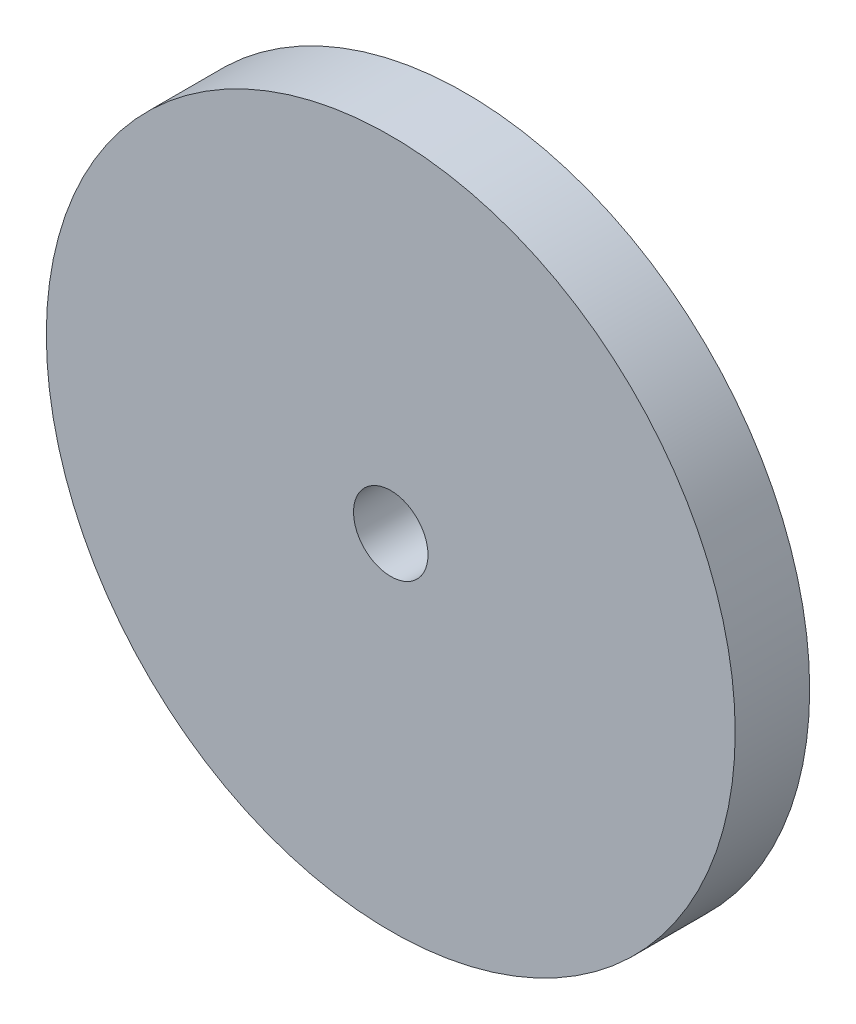
ISO-10303-21;
HEADER;
FILE_DESCRIPTION(('STEP AP214'),'2;1');
FILE_NAME('part.step','',(''),(''),'','','');
FILE_SCHEMA(('AUTOMOTIVE_DESIGN { 1 0 10303 214 1 1 1 1 }'));
ENDSEC;
DATA;
#1=APPLICATION_CONTEXT('core data for automotive mechanical design processes');
#2=APPLICATION_PROTOCOL_DEFINITION('international standard','automotive_design',2000,#1);
#3=PRODUCT_CONTEXT('',#1,'mechanical');
#4=PRODUCT('Part','Part','',(#3));
#5=PRODUCT_RELATED_PRODUCT_CATEGORY('part','',(#4));
#6=PRODUCT_DEFINITION_FORMATION('','',#4);
#7=PRODUCT_DEFINITION_CONTEXT('part definition',#1,'design');
#8=PRODUCT_DEFINITION('design','',#6,#7);
#9=PRODUCT_DEFINITION_SHAPE('','',#8);
#10=(LENGTH_UNIT() NAMED_UNIT(*) SI_UNIT(.MILLI.,.METRE.));
#11=(NAMED_UNIT(*) PLANE_ANGLE_UNIT() SI_UNIT($,.RADIAN.));
#12=(NAMED_UNIT(*) SI_UNIT($,.STERADIAN.) SOLID_ANGLE_UNIT());
#13=UNCERTAINTY_MEASURE_WITH_UNIT(LENGTH_MEASURE(1.E-05),#10,'distance_accuracy_value','');
#14=(GEOMETRIC_REPRESENTATION_CONTEXT(3) GLOBAL_UNCERTAINTY_ASSIGNED_CONTEXT((#13)) GLOBAL_UNIT_ASSIGNED_CONTEXT((#10,
#11,#12)) REPRESENTATION_CONTEXT('',''));
#15=CARTESIAN_POINT('',(0.,0.,0.));
#16=DIRECTION('',(0.,0.,1.));
#17=DIRECTION('',(1.,0.,0.));
#18=AXIS2_PLACEMENT_3D('',#15,#16,#17);
#19=CARTESIAN_POINT('',(0.,0.,4.));
#20=DIRECTION('',(0.,0.,1.));
#21=DIRECTION('',(1.,0.,0.));
#22=AXIS2_PLACEMENT_3D('',#19,#20,#21);
#23=PLANE('',#22);
#24=CARTESIAN_POINT('',(0.,0.,4.));
#25=DIRECTION('',(0.,0.,1.));
#26=DIRECTION('',(1.,0.,0.));
#27=AXIS2_PLACEMENT_3D('',#24,#25,#26);
#28=CIRCLE('',#27,18.5);
#29=CARTESIAN_POINT('',(18.5,0.,4.));
#30=VERTEX_POINT('',#29);
#31=EDGE_CURVE('E10',#30,#30,#28,.T.);
#32=ORIENTED_EDGE('',*,*,#31,.T.);
#33=EDGE_LOOP('',(#32));
#34=FACE_BOUND('',#33,.T.);
#35=CARTESIAN_POINT('',(0.,0.,4.));
#36=DIRECTION('',(0.,0.,1.));
#37=DIRECTION('',(1.,0.,0.));
#38=AXIS2_PLACEMENT_3D('',#35,#36,#37);
#39=CIRCLE('',#38,2.);
#40=CARTESIAN_POINT('',(2.,0.,4.));
#41=VERTEX_POINT('',#40);
#42=EDGE_CURVE('E56',#41,#41,#39,.T.);
#43=ORIENTED_EDGE('',*,*,#42,.F.);
#44=EDGE_LOOP('',(#43));
#45=FACE_BOUND('',#44,.T.);
#46=ADVANCED_FACE('F43',(#34,#45),#23,.T.);
#47=CARTESIAN_POINT('',(0.,0.,0.));
#48=DIRECTION('',(0.,0.,1.));
#49=DIRECTION('',(1.,0.,0.));
#50=AXIS2_PLACEMENT_3D('',#47,#48,#49);
#51=PLANE('',#50);
#52=CARTESIAN_POINT('',(0.,0.,0.));
#53=DIRECTION('',(0.,0.,1.));
#54=DIRECTION('',(1.,0.,0.));
#55=AXIS2_PLACEMENT_3D('',#52,#53,#54);
#56=CIRCLE('',#55,18.5);
#57=CARTESIAN_POINT('',(18.5,0.,0.));
#58=VERTEX_POINT('',#57);
#59=EDGE_CURVE('E47',#58,#58,#56,.T.);
#60=ORIENTED_EDGE('',*,*,#59,.F.);
#61=EDGE_LOOP('',(#60));
#62=FACE_BOUND('',#61,.T.);
#63=CARTESIAN_POINT('',(0.,0.,0.));
#64=DIRECTION('',(0.,0.,1.));
#65=DIRECTION('',(1.,0.,0.));
#66=AXIS2_PLACEMENT_3D('',#63,#64,#65);
#67=CIRCLE('',#66,2.);
#68=CARTESIAN_POINT('',(2.,0.,0.));
#69=VERTEX_POINT('',#68);
#70=EDGE_CURVE('E58',#69,#69,#67,.T.);
#71=ORIENTED_EDGE('',*,*,#70,.T.);
#72=EDGE_LOOP('',(#71));
#73=FACE_BOUND('',#72,.T.);
#74=ADVANCED_FACE('F70',(#62,#73),#51,.F.);
#75=CARTESIAN_POINT('',(0.,0.,4.));
#76=DIRECTION('',(0.,0.,-1.));
#77=DIRECTION('',(-1.,0.,0.));
#78=AXIS2_PLACEMENT_3D('',#75,#76,#77);
#79=CYLINDRICAL_SURFACE('',#78,18.5);
#80=ORIENTED_EDGE('',*,*,#31,.F.);
#81=EDGE_LOOP('',(#80));
#82=FACE_BOUND('',#81,.T.);
#83=ORIENTED_EDGE('',*,*,#59,.T.);
#84=EDGE_LOOP('',(#83));
#85=FACE_BOUND('',#84,.T.);
#86=ADVANCED_FACE('F45',(#82,#85),#79,.T.);
#87=CARTESIAN_POINT('',(0.,0.,4.));
#88=DIRECTION('',(0.,0.,-1.));
#89=DIRECTION('',(-1.,0.,0.));
#90=AXIS2_PLACEMENT_3D('',#87,#88,#89);
#91=CYLINDRICAL_SURFACE('',#90,2.);
#92=ORIENTED_EDGE('',*,*,#42,.T.);
#93=EDGE_LOOP('',(#92));
#94=FACE_BOUND('',#93,.T.);
#95=ORIENTED_EDGE('',*,*,#70,.F.);
#96=EDGE_LOOP('',(#95));
#97=FACE_BOUND('',#96,.T.);
#98=ADVANCED_FACE('F66',(#94,#97),#91,.F.);
#99=CLOSED_SHELL('',(#46,#74,#86,#98));
#100=MANIFOLD_SOLID_BREP('B2',#99);
#101=ADVANCED_BREP_SHAPE_REPRESENTATION('',(#18,#100),#14);
#102=SHAPE_DEFINITION_REPRESENTATION(#9,#101);
ENDSEC;
END-ISO-10303-21;
